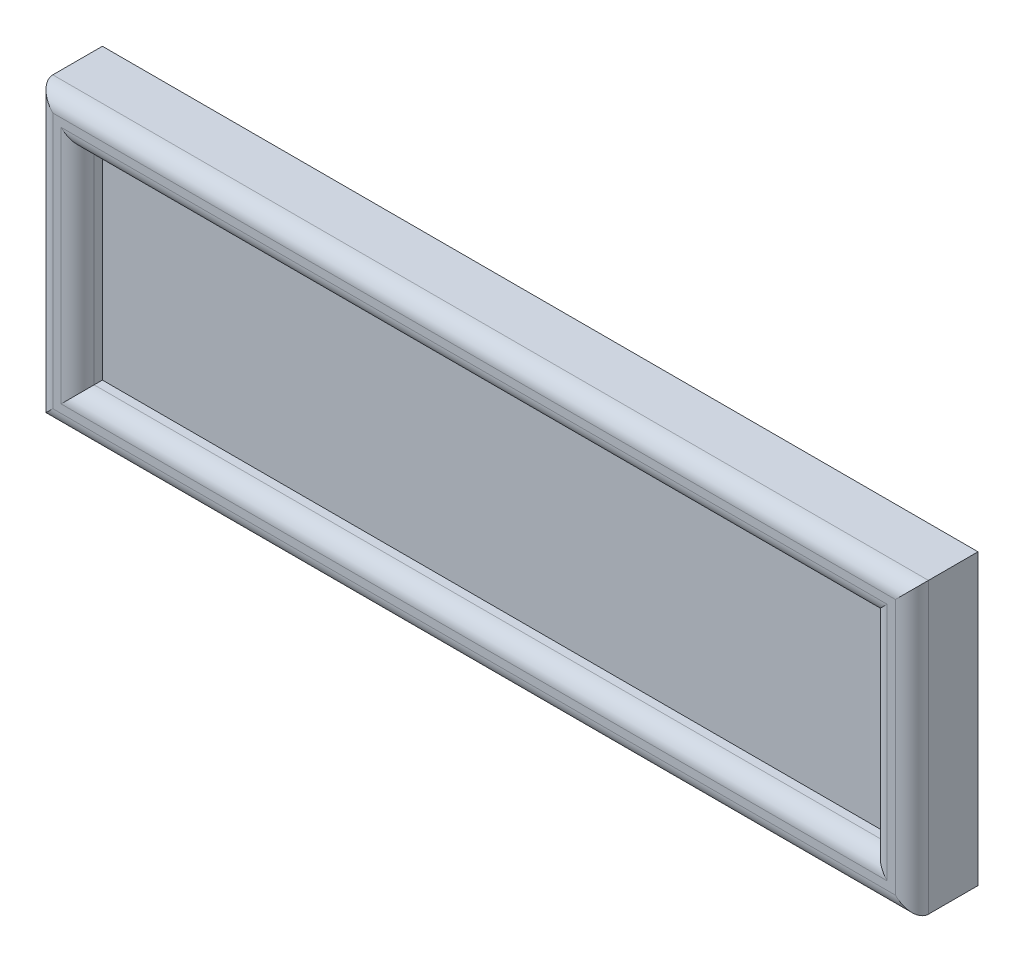
ISO-10303-21;
HEADER;
FILE_DESCRIPTION(('STEP AP214'),'2;1');
FILE_NAME('part.step','',(''),(''),'','','');
FILE_SCHEMA(('AUTOMOTIVE_DESIGN { 1 0 10303 214 1 1 1 1 }'));
ENDSEC;
DATA;
#1=APPLICATION_CONTEXT('core data for automotive mechanical design processes');
#2=APPLICATION_PROTOCOL_DEFINITION('international standard','automotive_design',2000,#1);
#3=PRODUCT_CONTEXT('',#1,'mechanical');
#4=PRODUCT('Part','Part','',(#3));
#5=PRODUCT_RELATED_PRODUCT_CATEGORY('part','',(#4));
#6=PRODUCT_DEFINITION_FORMATION('','',#4);
#7=PRODUCT_DEFINITION_CONTEXT('part definition',#1,'design');
#8=PRODUCT_DEFINITION('design','',#6,#7);
#9=PRODUCT_DEFINITION_SHAPE('','',#8);
#10=(LENGTH_UNIT() NAMED_UNIT(*) SI_UNIT(.MILLI.,.METRE.));
#11=(NAMED_UNIT(*) PLANE_ANGLE_UNIT() SI_UNIT($,.RADIAN.));
#12=(NAMED_UNIT(*) SI_UNIT($,.STERADIAN.) SOLID_ANGLE_UNIT());
#13=UNCERTAINTY_MEASURE_WITH_UNIT(LENGTH_MEASURE(1.E-05),#10,'distance_accuracy_value','');
#14=(GEOMETRIC_REPRESENTATION_CONTEXT(3) GLOBAL_UNCERTAINTY_ASSIGNED_CONTEXT((#13)) GLOBAL_UNIT_ASSIGNED_CONTEXT((#10,
#11,#12)) REPRESENTATION_CONTEXT('',''));
#15=CARTESIAN_POINT('',(0.,0.,0.));
#16=DIRECTION('',(0.,0.,1.));
#17=DIRECTION('',(1.,0.,0.));
#18=AXIS2_PLACEMENT_3D('',#15,#16,#17);
#19=CARTESIAN_POINT('',(-25.5,-7.75,-0.5));
#20=DIRECTION('',(-1.,0.,0.));
#21=DIRECTION('',(0.,0.,1.));
#22=AXIS2_PLACEMENT_3D('',#19,#20,#21);
#23=PLANE('',#22);
#24=DIRECTION('',(0.,0.,1.));
#25=VECTOR('',#24,1.);
#26=CARTESIAN_POINT('',(-25.5,-7.75,-0.5));
#27=LINE('',#26,#25);
#28=CARTESIAN_POINT('',(-25.5,-7.75,0.0999999999999987));
#29=VERTEX_POINT('',#28);
#30=CARTESIAN_POINT('',(-25.5,-7.75,0.5));
#31=VERTEX_POINT('',#30);
#32=EDGE_CURVE('E237',#29,#31,#27,.T.);
#33=ORIENTED_EDGE('',*,*,#32,.F.);
#34=DIRECTION('',(0.,1.,0.));
#35=VECTOR('',#34,1.);
#36=CARTESIAN_POINT('',(-25.5,-7.75,0.0999999999999987));
#37=LINE('',#36,#35);
#38=CARTESIAN_POINT('',(-25.5,7.75,0.100000000000004));
#39=VERTEX_POINT('',#38);
#40=EDGE_CURVE('E181',#29,#39,#37,.T.);
#41=ORIENTED_EDGE('',*,*,#40,.T.);
#42=DIRECTION('',(0.,0.,1.));
#43=VECTOR('',#42,1.);
#44=CARTESIAN_POINT('',(-25.5,7.75,-0.5));
#45=LINE('',#44,#43);
#46=CARTESIAN_POINT('',(-25.5,7.75,0.5));
#47=VERTEX_POINT('',#46);
#48=EDGE_CURVE('E252',#39,#47,#45,.T.);
#49=ORIENTED_EDGE('',*,*,#48,.T.);
#50=DIRECTION('',(0.,-1.,0.));
#51=VECTOR('',#50,1.);
#52=CARTESIAN_POINT('',(-25.5,-7.75,0.5));
#53=LINE('',#52,#51);
#54=EDGE_CURVE('E213',#47,#31,#53,.T.);
#55=ORIENTED_EDGE('',*,*,#54,.T.);
#56=EDGE_LOOP('',(#33,#41,#49,#55));
#57=FACE_BOUND('',#56,.T.);
#58=ADVANCED_FACE('F39',(#57),#23,.F.);
#59=CARTESIAN_POINT('',(-25.5,7.75,-0.5));
#60=VERTEX_POINT('',#59);
#61=CARTESIAN_POINT('',(-25.5,7.75,0.));
#62=VERTEX_POINT('',#61);
#63=EDGE_CURVE('E248',#60,#62,#45,.T.);
#64=ORIENTED_EDGE('',*,*,#63,.T.);
#65=DIRECTION('',(0.,-1.,0.));
#66=VECTOR('',#65,1.);
#67=CARTESIAN_POINT('',(-25.5,-7.75,0.));
#68=LINE('',#67,#66);
#69=CARTESIAN_POINT('',(-25.5,-7.75,0.));
#70=VERTEX_POINT('',#69);
#71=EDGE_CURVE('E201',#62,#70,#68,.T.);
#72=ORIENTED_EDGE('',*,*,#71,.T.);
#73=CARTESIAN_POINT('',(-25.5,-7.75,-0.5));
#74=VERTEX_POINT('',#73);
#75=EDGE_CURVE('E257',#74,#70,#27,.T.);
#76=ORIENTED_EDGE('',*,*,#75,.F.);
#77=DIRECTION('',(0.,-1.,0.));
#78=VECTOR('',#77,1.);
#79=CARTESIAN_POINT('',(-25.5,-7.75,-0.5));
#80=LINE('',#79,#78);
#81=EDGE_CURVE('E224',#60,#74,#80,.T.);
#82=ORIENTED_EDGE('',*,*,#81,.F.);
#83=EDGE_LOOP('',(#64,#72,#76,#82));
#84=FACE_BOUND('',#83,.T.);
#85=ADVANCED_FACE('F383',(#84),#23,.F.);
#86=CARTESIAN_POINT('',(25.5,7.75,-0.5));
#87=DIRECTION('',(0.,1.,0.));
#88=DIRECTION('',(0.,0.,1.));
#89=AXIS2_PLACEMENT_3D('',#86,#87,#88);
#90=PLANE('',#89);
#91=ORIENTED_EDGE('',*,*,#48,.F.);
#92=DIRECTION('',(1.,0.,0.));
#93=VECTOR('',#92,1.);
#94=CARTESIAN_POINT('',(-26.5,7.75,0.100000000000004));
#95=LINE('',#94,#93);
#96=CARTESIAN_POINT('',(-26.5,7.75,0.100000000000004));
#97=VERTEX_POINT('',#96);
#98=EDGE_CURVE('E199',#97,#39,#95,.T.);
#99=ORIENTED_EDGE('',*,*,#98,.F.);
#100=DIRECTION('',(0.,0.,1.));
#101=VECTOR('',#100,1.);
#102=CARTESIAN_POINT('',(-26.5,7.75,0.100000000000004));
#103=LINE('',#102,#101);
#104=CARTESIAN_POINT('',(-26.5,7.75,0.));
#105=VERTEX_POINT('',#104);
#106=EDGE_CURVE('E184',#105,#97,#103,.T.);
#107=ORIENTED_EDGE('',*,*,#106,.F.);
#108=DIRECTION('',(1.,0.,0.));
#109=VECTOR('',#108,1.);
#110=CARTESIAN_POINT('',(-26.5,7.75,0.));
#111=LINE('',#110,#109);
#112=EDGE_CURVE('E202',#105,#62,#111,.T.);
#113=ORIENTED_EDGE('',*,*,#112,.T.);
#114=ORIENTED_EDGE('',*,*,#63,.F.);
#115=DIRECTION('',(-1.,0.,0.));
#116=VECTOR('',#115,1.);
#117=CARTESIAN_POINT('',(25.5,7.75,-0.5));
#118=LINE('',#117,#116);
#119=CARTESIAN_POINT('',(25.5,7.75,-0.5));
#120=VERTEX_POINT('',#119);
#121=EDGE_CURVE('E234',#120,#60,#118,.T.);
#122=ORIENTED_EDGE('',*,*,#121,.F.);
#123=DIRECTION('',(0.,0.,1.));
#124=VECTOR('',#123,1.);
#125=CARTESIAN_POINT('',(25.5,7.75,-0.5));
#126=LINE('',#125,#124);
#127=CARTESIAN_POINT('',(25.5,7.75,0.5));
#128=VERTEX_POINT('',#127);
#129=EDGE_CURVE('E253',#120,#128,#126,.T.);
#130=ORIENTED_EDGE('',*,*,#129,.T.);
#131=DIRECTION('',(-1.,0.,0.));
#132=VECTOR('',#131,1.);
#133=CARTESIAN_POINT('',(25.5,7.75,0.5));
#134=LINE('',#133,#132);
#135=EDGE_CURVE('E228',#128,#47,#134,.T.);
#136=ORIENTED_EDGE('',*,*,#135,.T.);
#137=EDGE_LOOP('',(#91,#99,#107,#113,#114,#122,#130,#136));
#138=FACE_BOUND('',#137,.T.);
#139=ADVANCED_FACE('F389',(#138),#90,.F.);
#140=CARTESIAN_POINT('',(25.5,-7.75,-0.5));
#141=DIRECTION('',(1.,0.,0.));
#142=DIRECTION('',(0.,0.,-1.));
#143=AXIS2_PLACEMENT_3D('',#140,#141,#142);
#144=PLANE('',#143);
#145=DIRECTION('',(0.,1.,0.));
#146=VECTOR('',#145,1.);
#147=CARTESIAN_POINT('',(25.5,-7.75,0.5));
#148=LINE('',#147,#146);
#149=CARTESIAN_POINT('',(25.5,-7.75,0.5));
#150=VERTEX_POINT('',#149);
#151=EDGE_CURVE('E243',#150,#128,#148,.T.);
#152=ORIENTED_EDGE('',*,*,#151,.T.);
#153=ORIENTED_EDGE('',*,*,#129,.F.);
#154=DIRECTION('',(0.,1.,0.));
#155=VECTOR('',#154,1.);
#156=CARTESIAN_POINT('',(25.5,-7.75,-0.5));
#157=LINE('',#156,#155);
#158=CARTESIAN_POINT('',(25.5,-7.75,-0.5));
#159=VERTEX_POINT('',#158);
#160=EDGE_CURVE('E231',#159,#120,#157,.T.);
#161=ORIENTED_EDGE('',*,*,#160,.F.);
#162=DIRECTION('',(0.,0.,1.));
#163=VECTOR('',#162,1.);
#164=CARTESIAN_POINT('',(25.5,-7.75,-0.5));
#165=LINE('',#164,#163);
#166=EDGE_CURVE('E255',#159,#150,#165,.T.);
#167=ORIENTED_EDGE('',*,*,#166,.T.);
#168=EDGE_LOOP('',(#152,#153,#161,#167));
#169=FACE_BOUND('',#168,.T.);
#170=ADVANCED_FACE('F532',(#169),#144,.F.);
#171=CARTESIAN_POINT('',(25.5,-7.75,-0.5));
#172=DIRECTION('',(0.,-1.,0.));
#173=DIRECTION('',(0.,0.,-1.));
#174=AXIS2_PLACEMENT_3D('',#171,#172,#173);
#175=PLANE('',#174);
#176=ORIENTED_EDGE('',*,*,#75,.T.);
#177=DIRECTION('',(1.,0.,0.));
#178=VECTOR('',#177,1.);
#179=CARTESIAN_POINT('',(-26.5,-7.75,0.));
#180=LINE('',#179,#178);
#181=CARTESIAN_POINT('',(-26.5,-7.75,0.));
#182=VERTEX_POINT('',#181);
#183=EDGE_CURVE('E183',#182,#70,#180,.T.);
#184=ORIENTED_EDGE('',*,*,#183,.F.);
#185=DIRECTION('',(0.,0.,-1.));
#186=VECTOR('',#185,1.);
#187=CARTESIAN_POINT('',(-26.5,-7.75,0.0999999999999987));
#188=LINE('',#187,#186);
#189=CARTESIAN_POINT('',(-26.5,-7.75,0.0999999999999987));
#190=VERTEX_POINT('',#189);
#191=EDGE_CURVE('E187',#190,#182,#188,.T.);
#192=ORIENTED_EDGE('',*,*,#191,.F.);
#193=DIRECTION('',(1.,0.,0.));
#194=VECTOR('',#193,1.);
#195=CARTESIAN_POINT('',(-26.5,-7.75,0.0999999999999987));
#196=LINE('',#195,#194);
#197=EDGE_CURVE('E56',#190,#29,#196,.T.);
#198=ORIENTED_EDGE('',*,*,#197,.T.);
#199=ORIENTED_EDGE('',*,*,#32,.T.);
#200=DIRECTION('',(1.,0.,0.));
#201=VECTOR('',#200,1.);
#202=CARTESIAN_POINT('',(25.5,-7.75,0.5));
#203=LINE('',#202,#201);
#204=EDGE_CURVE('E240',#31,#150,#203,.T.);
#205=ORIENTED_EDGE('',*,*,#204,.T.);
#206=ORIENTED_EDGE('',*,*,#166,.F.);
#207=DIRECTION('',(1.,0.,0.));
#208=VECTOR('',#207,1.);
#209=CARTESIAN_POINT('',(25.5,-7.75,-0.5));
#210=LINE('',#209,#208);
#211=EDGE_CURVE('E227',#74,#159,#210,.T.);
#212=ORIENTED_EDGE('',*,*,#211,.F.);
#213=EDGE_LOOP('',(#176,#184,#192,#198,#199,#205,#206,#212));
#214=FACE_BOUND('',#213,.T.);
#215=ADVANCED_FACE('F189',(#214),#175,.F.);
#216=CARTESIAN_POINT('',(0.,0.,-0.5));
#217=DIRECTION('',(0.,0.,1.));
#218=DIRECTION('',(1.,0.,0.));
#219=AXIS2_PLACEMENT_3D('',#216,#217,#218);
#220=PLANE('',#219);
#221=ORIENTED_EDGE('',*,*,#81,.T.);
#222=ORIENTED_EDGE('',*,*,#211,.T.);
#223=ORIENTED_EDGE('',*,*,#160,.T.);
#224=ORIENTED_EDGE('',*,*,#121,.T.);
#225=EDGE_LOOP('',(#221,#222,#223,#224));
#226=FACE_BOUND('',#225,.T.);
#227=ADVANCED_FACE('F515',(#226),#220,.T.);
#228=CARTESIAN_POINT('',(0.,0.,0.5));
#229=DIRECTION('',(0.,0.,1.));
#230=DIRECTION('',(1.,0.,0.));
#231=AXIS2_PLACEMENT_3D('',#228,#229,#230);
#232=PLANE('',#231);
#233=DIRECTION('',(-1.,0.,0.));
#234=VECTOR('',#233,1.);
#235=CARTESIAN_POINT('',(0.,6.25,0.5));
#236=LINE('',#235,#234);
#237=CARTESIAN_POINT('',(24.,6.25,0.5));
#238=VERTEX_POINT('',#237);
#239=CARTESIAN_POINT('',(-24.,6.25,0.5));
#240=VERTEX_POINT('',#239);
#241=EDGE_CURVE('E284',#238,#240,#236,.T.);
#242=ORIENTED_EDGE('',*,*,#241,.T.);
#243=DIRECTION('',(0.,-1.,0.));
#244=VECTOR('',#243,1.);
#245=CARTESIAN_POINT('',(-24.,0.,0.5));
#246=LINE('',#245,#244);
#247=CARTESIAN_POINT('',(-24.,-6.25,0.5));
#248=VERTEX_POINT('',#247);
#249=EDGE_CURVE('E287',#240,#248,#246,.T.);
#250=ORIENTED_EDGE('',*,*,#249,.T.);
#251=DIRECTION('',(1.,0.,0.));
#252=VECTOR('',#251,1.);
#253=CARTESIAN_POINT('',(0.,-6.25,0.5));
#254=LINE('',#253,#252);
#255=CARTESIAN_POINT('',(24.,-6.25,0.5));
#256=VERTEX_POINT('',#255);
#257=EDGE_CURVE('E278',#248,#256,#254,.T.);
#258=ORIENTED_EDGE('',*,*,#257,.T.);
#259=DIRECTION('',(0.,1.,0.));
#260=VECTOR('',#259,1.);
#261=CARTESIAN_POINT('',(24.,0.,0.5));
#262=LINE('',#261,#260);
#263=EDGE_CURVE('E281',#256,#238,#262,.T.);
#264=ORIENTED_EDGE('',*,*,#263,.T.);
#265=EDGE_LOOP('',(#242,#250,#258,#264));
#266=FACE_BOUND('',#265,.T.);
#267=ORIENTED_EDGE('',*,*,#54,.F.);
#268=ORIENTED_EDGE('',*,*,#135,.F.);
#269=ORIENTED_EDGE('',*,*,#151,.F.);
#270=ORIENTED_EDGE('',*,*,#204,.F.);
#271=EDGE_LOOP('',(#267,#268,#269,#270));
#272=FACE_BOUND('',#271,.T.);
#273=ADVANCED_FACE('F366',(#266,#272),#232,.F.);
#274=CARTESIAN_POINT('',(-24.,-6.25,0.));
#275=DIRECTION('',(-1.,0.,0.));
#276=DIRECTION('',(0.,0.,1.));
#277=AXIS2_PLACEMENT_3D('',#274,#275,#276);
#278=PLANE('',#277);
#279=DIRECTION('',(0.,0.,1.));
#280=VECTOR('',#279,1.);
#281=CARTESIAN_POINT('',(-24.,6.25,0.));
#282=LINE('',#281,#280);
#283=CARTESIAN_POINT('',(-24.,6.25,1.));
#284=VERTEX_POINT('',#283);
#285=EDGE_CURVE('E210',#240,#284,#282,.T.);
#286=ORIENTED_EDGE('',*,*,#285,.T.);
#287=DIRECTION('',(0.,-1.,0.));
#288=VECTOR('',#287,1.);
#289=CARTESIAN_POINT('',(-24.,-6.25,1.));
#290=LINE('',#289,#288);
#291=CARTESIAN_POINT('',(-24.,-6.25,1.));
#292=VERTEX_POINT('',#291);
#293=EDGE_CURVE('E11',#284,#292,#290,.T.);
#294=ORIENTED_EDGE('',*,*,#293,.T.);
#295=DIRECTION('',(0.,0.,1.));
#296=VECTOR('',#295,1.);
#297=CARTESIAN_POINT('',(-24.,-6.25,0.));
#298=LINE('',#297,#296);
#299=EDGE_CURVE('E220',#248,#292,#298,.T.);
#300=ORIENTED_EDGE('',*,*,#299,.F.);
#301=ORIENTED_EDGE('',*,*,#249,.F.);
#302=EDGE_LOOP('',(#286,#294,#300,#301));
#303=FACE_BOUND('',#302,.T.);
#304=ADVANCED_FACE('F369',(#303),#278,.F.);
#305=CARTESIAN_POINT('',(24.,6.25,0.));
#306=DIRECTION('',(0.,1.,0.));
#307=DIRECTION('',(0.,0.,1.));
#308=AXIS2_PLACEMENT_3D('',#305,#306,#307);
#309=PLANE('',#308);
#310=DIRECTION('',(0.,0.,1.));
#311=VECTOR('',#310,1.);
#312=CARTESIAN_POINT('',(24.,6.25,0.));
#313=LINE('',#312,#311);
#314=CARTESIAN_POINT('',(24.,6.25,1.));
#315=VERTEX_POINT('',#314);
#316=EDGE_CURVE('E214',#238,#315,#313,.T.);
#317=ORIENTED_EDGE('',*,*,#316,.T.);
#318=DIRECTION('',(-1.,0.,0.));
#319=VECTOR('',#318,1.);
#320=CARTESIAN_POINT('',(-24.,6.25,1.));
#321=LINE('',#320,#319);
#322=EDGE_CURVE('E48',#315,#284,#321,.T.);
#323=ORIENTED_EDGE('',*,*,#322,.T.);
#324=ORIENTED_EDGE('',*,*,#285,.F.);
#325=ORIENTED_EDGE('',*,*,#241,.F.);
#326=EDGE_LOOP('',(#317,#323,#324,#325));
#327=FACE_BOUND('',#326,.T.);
#328=ADVANCED_FACE('F372',(#327),#309,.F.);
#329=CARTESIAN_POINT('',(24.,-6.25,0.));
#330=DIRECTION('',(1.,0.,0.));
#331=DIRECTION('',(0.,0.,-1.));
#332=AXIS2_PLACEMENT_3D('',#329,#330,#331);
#333=PLANE('',#332);
#334=DIRECTION('',(0.,0.,1.));
#335=VECTOR('',#334,1.);
#336=CARTESIAN_POINT('',(24.,-6.25,0.));
#337=LINE('',#336,#335);
#338=CARTESIAN_POINT('',(24.,-6.25,1.));
#339=VERTEX_POINT('',#338);
#340=EDGE_CURVE('E217',#256,#339,#337,.T.);
#341=ORIENTED_EDGE('',*,*,#340,.T.);
#342=DIRECTION('',(0.,1.,0.));
#343=VECTOR('',#342,1.);
#344=CARTESIAN_POINT('',(24.,6.25,1.));
#345=LINE('',#344,#343);
#346=EDGE_CURVE('E320',#339,#315,#345,.T.);
#347=ORIENTED_EDGE('',*,*,#346,.T.);
#348=ORIENTED_EDGE('',*,*,#316,.F.);
#349=ORIENTED_EDGE('',*,*,#263,.F.);
#350=EDGE_LOOP('',(#341,#347,#348,#349));
#351=FACE_BOUND('',#350,.T.);
#352=ADVANCED_FACE('F364',(#351),#333,.F.);
#353=CARTESIAN_POINT('',(24.,-6.25,0.));
#354=DIRECTION('',(0.,-1.,0.));
#355=DIRECTION('',(0.,0.,-1.));
#356=AXIS2_PLACEMENT_3D('',#353,#354,#355);
#357=PLANE('',#356);
#358=ORIENTED_EDGE('',*,*,#299,.T.);
#359=DIRECTION('',(1.,0.,0.));
#360=VECTOR('',#359,1.);
#361=CARTESIAN_POINT('',(24.,-6.25,1.));
#362=LINE('',#361,#360);
#363=EDGE_CURVE('E317',#292,#339,#362,.T.);
#364=ORIENTED_EDGE('',*,*,#363,.T.);
#365=ORIENTED_EDGE('',*,*,#340,.F.);
#366=ORIENTED_EDGE('',*,*,#257,.F.);
#367=EDGE_LOOP('',(#358,#364,#365,#366));
#368=FACE_BOUND('',#367,.T.);
#369=ADVANCED_FACE('F361',(#368),#357,.F.);
#370=CARTESIAN_POINT('',(-26.5,-8.75,2.));
#371=DIRECTION('',(1.,0.,0.));
#372=DIRECTION('',(0.,0.,-1.));
#373=AXIS2_PLACEMENT_3D('',#370,#371,#372);
#374=PLANE('',#373);
#375=ORIENTED_EDGE('',*,*,#106,.T.);
#376=DIRECTION('',(0.,-1.,0.));
#377=VECTOR('',#376,1.);
#378=CARTESIAN_POINT('',(-26.5,-7.75,0.0999999999999987));
#379=LINE('',#378,#377);
#380=EDGE_CURVE('E178',#97,#190,#379,.T.);
#381=ORIENTED_EDGE('',*,*,#380,.T.);
#382=ORIENTED_EDGE('',*,*,#191,.T.);
#383=DIRECTION('',(0.,1.,0.));
#384=VECTOR('',#383,1.);
#385=CARTESIAN_POINT('',(-26.5,-7.75,0.));
#386=LINE('',#385,#384);
#387=EDGE_CURVE('E64',#182,#105,#386,.T.);
#388=ORIENTED_EDGE('',*,*,#387,.T.);
#389=EDGE_LOOP('',(#375,#381,#382,#388));
#390=FACE_BOUND('',#389,.T.);
#391=DIRECTION('',(0.,0.,-1.));
#392=VECTOR('',#391,1.);
#393=CARTESIAN_POINT('',(-26.5,-8.75,2.));
#394=LINE('',#393,#392);
#395=CARTESIAN_POINT('',(-26.5,-8.75,1.));
#396=VERTEX_POINT('',#395);
#397=CARTESIAN_POINT('',(-26.5,-8.75,-2.));
#398=VERTEX_POINT('',#397);
#399=EDGE_CURVE('E276',#396,#398,#394,.T.);
#400=ORIENTED_EDGE('',*,*,#399,.F.);
#401=DIRECTION('',(0.,-1.,0.));
#402=VECTOR('',#401,1.);
#403=CARTESIAN_POINT('',(-26.5,8.75,1.));
#404=LINE('',#403,#402);
#405=CARTESIAN_POINT('',(-26.5,8.75,1.));
#406=VERTEX_POINT('',#405);
#407=EDGE_CURVE('E315',#396,#406,#404,.F.);
#408=ORIENTED_EDGE('',*,*,#407,.T.);
#409=DIRECTION('',(0.,0.,-1.));
#410=VECTOR('',#409,1.);
#411=CARTESIAN_POINT('',(-26.5,8.75,2.));
#412=LINE('',#411,#410);
#413=CARTESIAN_POINT('',(-26.5,8.75,-2.));
#414=VERTEX_POINT('',#413);
#415=EDGE_CURVE('E270',#406,#414,#412,.T.);
#416=ORIENTED_EDGE('',*,*,#415,.T.);
#417=DIRECTION('',(0.,-1.,0.));
#418=VECTOR('',#417,1.);
#419=CARTESIAN_POINT('',(-26.5,-8.75,-2.));
#420=LINE('',#419,#418);
#421=EDGE_CURVE('E251',#414,#398,#420,.T.);
#422=ORIENTED_EDGE('',*,*,#421,.T.);
#423=EDGE_LOOP('',(#400,#408,#416,#422));
#424=FACE_BOUND('',#423,.T.);
#425=ADVANCED_FACE('F192',(#390,#424),#374,.F.);
#426=CARTESIAN_POINT('',(26.5,-8.75,2.));
#427=DIRECTION('',(0.,1.,0.));
#428=DIRECTION('',(0.,0.,1.));
#429=AXIS2_PLACEMENT_3D('',#426,#427,#428);
#430=PLANE('',#429);
#431=DIRECTION('',(0.,0.,-1.));
#432=VECTOR('',#431,1.);
#433=CARTESIAN_POINT('',(26.5,-8.75,2.));
#434=LINE('',#433,#432);
#435=CARTESIAN_POINT('',(26.5,-8.75,1.));
#436=VERTEX_POINT('',#435);
#437=CARTESIAN_POINT('',(26.5,-8.75,-2.));
#438=VERTEX_POINT('',#437);
#439=EDGE_CURVE('E274',#436,#438,#434,.T.);
#440=ORIENTED_EDGE('',*,*,#439,.F.);
#441=DIRECTION('',(1.,0.,0.));
#442=VECTOR('',#441,1.);
#443=CARTESIAN_POINT('',(-26.5,-8.75,1.));
#444=LINE('',#443,#442);
#445=EDGE_CURVE('E313',#436,#396,#444,.F.);
#446=ORIENTED_EDGE('',*,*,#445,.T.);
#447=ORIENTED_EDGE('',*,*,#399,.T.);
#448=DIRECTION('',(1.,0.,0.));
#449=VECTOR('',#448,1.);
#450=CARTESIAN_POINT('',(26.5,-8.75,-2.));
#451=LINE('',#450,#449);
#452=EDGE_CURVE('E261',#398,#438,#451,.T.);
#453=ORIENTED_EDGE('',*,*,#452,.T.);
#454=EDGE_LOOP('',(#440,#446,#447,#453));
#455=FACE_BOUND('',#454,.T.);
#456=ADVANCED_FACE('F409',(#455),#430,.F.);
#457=CARTESIAN_POINT('',(26.5,-8.75,2.));
#458=DIRECTION('',(-1.,0.,0.));
#459=DIRECTION('',(0.,0.,1.));
#460=AXIS2_PLACEMENT_3D('',#457,#458,#459);
#461=PLANE('',#460);
#462=DIRECTION('',(0.,0.,-1.));
#463=VECTOR('',#462,1.);
#464=CARTESIAN_POINT('',(26.5,8.75,2.));
#465=LINE('',#464,#463);
#466=CARTESIAN_POINT('',(26.5,8.75,1.));
#467=VERTEX_POINT('',#466);
#468=CARTESIAN_POINT('',(26.5,8.75,-2.));
#469=VERTEX_POINT('',#468);
#470=EDGE_CURVE('E272',#467,#469,#465,.T.);
#471=ORIENTED_EDGE('',*,*,#470,.F.);
#472=DIRECTION('',(0.,1.,0.));
#473=VECTOR('',#472,1.);
#474=CARTESIAN_POINT('',(26.5,-8.75,1.));
#475=LINE('',#474,#473);
#476=EDGE_CURVE('E311',#467,#436,#475,.F.);
#477=ORIENTED_EDGE('',*,*,#476,.T.);
#478=ORIENTED_EDGE('',*,*,#439,.T.);
#479=DIRECTION('',(0.,1.,0.));
#480=VECTOR('',#479,1.);
#481=CARTESIAN_POINT('',(26.5,-8.75,-2.));
#482=LINE('',#481,#480);
#483=EDGE_CURVE('E264',#438,#469,#482,.T.);
#484=ORIENTED_EDGE('',*,*,#483,.T.);
#485=EDGE_LOOP('',(#471,#477,#478,#484));
#486=FACE_BOUND('',#485,.T.);
#487=ADVANCED_FACE('F405',(#486),#461,.F.);
#488=CARTESIAN_POINT('',(26.5,8.75,2.));
#489=DIRECTION('',(0.,-1.,0.));
#490=DIRECTION('',(0.,0.,-1.));
#491=AXIS2_PLACEMENT_3D('',#488,#489,#490);
#492=PLANE('',#491);
#493=ORIENTED_EDGE('',*,*,#415,.F.);
#494=DIRECTION('',(-1.,0.,0.));
#495=VECTOR('',#494,1.);
#496=CARTESIAN_POINT('',(26.5,8.75,1.));
#497=LINE('',#496,#495);
#498=EDGE_CURVE('E308',#406,#467,#497,.F.);
#499=ORIENTED_EDGE('',*,*,#498,.T.);
#500=ORIENTED_EDGE('',*,*,#470,.T.);
#501=DIRECTION('',(-1.,0.,0.));
#502=VECTOR('',#501,1.);
#503=CARTESIAN_POINT('',(26.5,8.75,-2.));
#504=LINE('',#503,#502);
#505=EDGE_CURVE('E267',#469,#414,#504,.T.);
#506=ORIENTED_EDGE('',*,*,#505,.T.);
#507=EDGE_LOOP('',(#493,#499,#500,#506));
#508=FACE_BOUND('',#507,.T.);
#509=ADVANCED_FACE('F397',(#508),#492,.F.);
#510=CARTESIAN_POINT('',(0.,0.,2.));
#511=DIRECTION('',(0.,0.,1.));
#512=DIRECTION('',(1.,0.,0.));
#513=AXIS2_PLACEMENT_3D('',#510,#511,#512);
#514=PLANE('',#513);
#515=DIRECTION('',(0.,1.,0.));
#516=VECTOR('',#515,1.);
#517=CARTESIAN_POINT('',(25.5,8.75,2.));
#518=LINE('',#517,#516);
#519=CARTESIAN_POINT('',(25.5,-7.75,2.));
#520=VERTEX_POINT('',#519);
#521=CARTESIAN_POINT('',(25.5,7.75,2.));
#522=VERTEX_POINT('',#521);
#523=EDGE_CURVE('E303',#520,#522,#518,.T.);
#524=ORIENTED_EDGE('',*,*,#523,.T.);
#525=DIRECTION('',(-1.,0.,0.));
#526=VECTOR('',#525,1.);
#527=CARTESIAN_POINT('',(-26.5,7.75,2.));
#528=LINE('',#527,#526);
#529=CARTESIAN_POINT('',(-25.5,7.75,2.));
#530=VERTEX_POINT('',#529);
#531=EDGE_CURVE('E305',#522,#530,#528,.T.);
#532=ORIENTED_EDGE('',*,*,#531,.T.);
#533=DIRECTION('',(0.,-1.,0.));
#534=VECTOR('',#533,1.);
#535=CARTESIAN_POINT('',(-25.5,-8.75,2.));
#536=LINE('',#535,#534);
#537=CARTESIAN_POINT('',(-25.5,-7.75,2.));
#538=VERTEX_POINT('',#537);
#539=EDGE_CURVE('E299',#530,#538,#536,.T.);
#540=ORIENTED_EDGE('',*,*,#539,.T.);
#541=DIRECTION('',(1.,0.,0.));
#542=VECTOR('',#541,1.);
#543=CARTESIAN_POINT('',(26.5,-7.75,2.));
#544=LINE('',#543,#542);
#545=EDGE_CURVE('E301',#538,#520,#544,.T.);
#546=ORIENTED_EDGE('',*,*,#545,.T.);
#547=EDGE_LOOP('',(#524,#532,#540,#546));
#548=FACE_BOUND('',#547,.T.);
#549=DIRECTION('',(0.,1.,0.));
#550=VECTOR('',#549,1.);
#551=CARTESIAN_POINT('',(25.,-6.25,2.));
#552=LINE('',#551,#550);
#553=CARTESIAN_POINT('',(25.,7.25,2.));
#554=VERTEX_POINT('',#553);
#555=CARTESIAN_POINT('',(25.,-7.25,2.));
#556=VERTEX_POINT('',#555);
#557=EDGE_CURVE('E294',#554,#556,#552,.F.);
#558=ORIENTED_EDGE('',*,*,#557,.T.);
#559=DIRECTION('',(1.,0.,0.));
#560=VECTOR('',#559,1.);
#561=CARTESIAN_POINT('',(-24.,-7.25,2.));
#562=LINE('',#561,#560);
#563=CARTESIAN_POINT('',(-25.,-7.25,2.));
#564=VERTEX_POINT('',#563);
#565=EDGE_CURVE('E296',#556,#564,#562,.F.);
#566=ORIENTED_EDGE('',*,*,#565,.T.);
#567=DIRECTION('',(0.,-1.,0.));
#568=VECTOR('',#567,1.);
#569=CARTESIAN_POINT('',(-25.,6.25,2.));
#570=LINE('',#569,#568);
#571=CARTESIAN_POINT('',(-25.,7.25,2.));
#572=VERTEX_POINT('',#571);
#573=EDGE_CURVE('E290',#564,#572,#570,.F.);
#574=ORIENTED_EDGE('',*,*,#573,.T.);
#575=DIRECTION('',(-1.,0.,0.));
#576=VECTOR('',#575,1.);
#577=CARTESIAN_POINT('',(24.,7.25,2.));
#578=LINE('',#577,#576);
#579=EDGE_CURVE('E292',#572,#554,#578,.F.);
#580=ORIENTED_EDGE('',*,*,#579,.T.);
#581=EDGE_LOOP('',(#558,#566,#574,#580));
#582=FACE_BOUND('',#581,.T.);
#583=ADVANCED_FACE('F351',(#548,#582),#514,.T.);
#584=CARTESIAN_POINT('',(0.,0.,-2.));
#585=DIRECTION('',(0.,0.,1.));
#586=DIRECTION('',(1.,0.,0.));
#587=AXIS2_PLACEMENT_3D('',#584,#585,#586);
#588=PLANE('',#587);
#589=ORIENTED_EDGE('',*,*,#421,.F.);
#590=ORIENTED_EDGE('',*,*,#505,.F.);
#591=ORIENTED_EDGE('',*,*,#483,.F.);
#592=ORIENTED_EDGE('',*,*,#452,.F.);
#593=EDGE_LOOP('',(#589,#590,#591,#592));
#594=FACE_BOUND('',#593,.T.);
#595=ADVANCED_FACE('F396',(#594),#588,.F.);
#596=CARTESIAN_POINT('',(0.,-7.75,1.));
#597=DIRECTION('',(-1.,0.,0.));
#598=DIRECTION('',(0.,0.,1.));
#599=AXIS2_PLACEMENT_3D('',#596,#597,#598);
#600=CYLINDRICAL_SURFACE('',#599,1.);
#601=CARTESIAN_POINT('',(-25.5,-7.75,1.));
#602=DIRECTION('',(-0.707106781186547,0.707106781186547,0.));
#603=DIRECTION('',(0.707106781186547,0.707106781186547,0.));
#604=AXIS2_PLACEMENT_3D('',#601,#602,#603);
#605=ELLIPSE('',#604,1.41421356237309,1.);
#606=EDGE_CURVE('E327',#396,#538,#605,.T.);
#607=ORIENTED_EDGE('',*,*,#606,.F.);
#608=ORIENTED_EDGE('',*,*,#445,.F.);
#609=CARTESIAN_POINT('',(25.5,-7.75,1.));
#610=DIRECTION('',(-0.707106781186547,-0.707106781186547,0.));
#611=DIRECTION('',(-0.707106781186547,0.707106781186547,0.));
#612=AXIS2_PLACEMENT_3D('',#609,#610,#611);
#613=ELLIPSE('',#612,1.41421356237309,1.);
#614=EDGE_CURVE('E223',#520,#436,#613,.F.);
#615=ORIENTED_EDGE('',*,*,#614,.F.);
#616=ORIENTED_EDGE('',*,*,#545,.F.);
#617=EDGE_LOOP('',(#607,#608,#615,#616));
#618=FACE_BOUND('',#617,.T.);
#619=ADVANCED_FACE('F401',(#618),#600,.T.);
#620=CARTESIAN_POINT('',(25.5,0.,1.));
#621=DIRECTION('',(0.,-1.,0.));
#622=DIRECTION('',(0.,0.,-1.));
#623=AXIS2_PLACEMENT_3D('',#620,#621,#622);
#624=CYLINDRICAL_SURFACE('',#623,1.);
#625=ORIENTED_EDGE('',*,*,#614,.T.);
#626=ORIENTED_EDGE('',*,*,#476,.F.);
#627=CARTESIAN_POINT('',(25.5,7.75,1.));
#628=DIRECTION('',(0.707106781186547,-0.707106781186547,0.));
#629=DIRECTION('',(-0.707106781186547,-0.707106781186547,0.));
#630=AXIS2_PLACEMENT_3D('',#627,#628,#629);
#631=ELLIPSE('',#630,1.41421356237309,1.);
#632=EDGE_CURVE('E325',#522,#467,#631,.F.);
#633=ORIENTED_EDGE('',*,*,#632,.F.);
#634=ORIENTED_EDGE('',*,*,#523,.F.);
#635=EDGE_LOOP('',(#625,#626,#633,#634));
#636=FACE_BOUND('',#635,.T.);
#637=ADVANCED_FACE('F423',(#636),#624,.T.);
#638=CARTESIAN_POINT('',(-25.5,0.,1.));
#639=DIRECTION('',(0.,1.,0.));
#640=DIRECTION('',(0.,0.,1.));
#641=AXIS2_PLACEMENT_3D('',#638,#639,#640);
#642=CYLINDRICAL_SURFACE('',#641,1.);
#643=ORIENTED_EDGE('',*,*,#606,.T.);
#644=ORIENTED_EDGE('',*,*,#539,.F.);
#645=CARTESIAN_POINT('',(-25.5,7.75,1.));
#646=DIRECTION('',(0.707106781186547,0.707106781186547,0.));
#647=DIRECTION('',(-0.707106781186547,0.707106781186547,0.));
#648=AXIS2_PLACEMENT_3D('',#645,#646,#647);
#649=ELLIPSE('',#648,1.41421356237309,1.);
#650=EDGE_CURVE('E323',#406,#530,#649,.T.);
#651=ORIENTED_EDGE('',*,*,#650,.F.);
#652=ORIENTED_EDGE('',*,*,#407,.F.);
#653=EDGE_LOOP('',(#643,#644,#651,#652));
#654=FACE_BOUND('',#653,.T.);
#655=ADVANCED_FACE('F419',(#654),#642,.T.);
#656=CARTESIAN_POINT('',(0.,7.75,1.));
#657=DIRECTION('',(1.,0.,0.));
#658=DIRECTION('',(0.,0.,-1.));
#659=AXIS2_PLACEMENT_3D('',#656,#657,#658);
#660=CYLINDRICAL_SURFACE('',#659,1.);
#661=ORIENTED_EDGE('',*,*,#632,.T.);
#662=ORIENTED_EDGE('',*,*,#498,.F.);
#663=ORIENTED_EDGE('',*,*,#650,.T.);
#664=ORIENTED_EDGE('',*,*,#531,.F.);
#665=EDGE_LOOP('',(#661,#662,#663,#664));
#666=FACE_BOUND('',#665,.T.);
#667=ADVANCED_FACE('F416',(#666),#660,.T.);
#668=CARTESIAN_POINT('',(24.,7.25,1.));
#669=DIRECTION('',(1.,0.,0.));
#670=DIRECTION('',(0.,0.,-1.));
#671=AXIS2_PLACEMENT_3D('',#668,#669,#670);
#672=CYLINDRICAL_SURFACE('',#671,1.);
#673=CARTESIAN_POINT('',(25.,7.25,1.));
#674=DIRECTION('',(0.707106781186547,-0.707106781186547,0.));
#675=DIRECTION('',(-0.707106781186547,-0.707106781186547,0.));
#676=AXIS2_PLACEMENT_3D('',#673,#674,#675);
#677=ELLIPSE('',#676,1.41421356237309,1.);
#678=EDGE_CURVE('E334',#554,#315,#677,.T.);
#679=ORIENTED_EDGE('',*,*,#678,.F.);
#680=ORIENTED_EDGE('',*,*,#579,.F.);
#681=CARTESIAN_POINT('',(-25.,7.25,1.));
#682=DIRECTION('',(0.707106781186547,0.707106781186547,0.));
#683=DIRECTION('',(0.707106781186547,-0.707106781186547,0.));
#684=AXIS2_PLACEMENT_3D('',#681,#682,#683);
#685=ELLIPSE('',#684,1.41421356237309,1.);
#686=EDGE_CURVE('E43',#284,#572,#685,.F.);
#687=ORIENTED_EDGE('',*,*,#686,.F.);
#688=ORIENTED_EDGE('',*,*,#322,.F.);
#689=EDGE_LOOP('',(#679,#680,#687,#688));
#690=FACE_BOUND('',#689,.T.);
#691=ADVANCED_FACE('F41',(#690),#672,.T.);
#692=CARTESIAN_POINT('',(-25.,-6.25,1.));
#693=DIRECTION('',(0.,1.,0.));
#694=DIRECTION('',(0.,0.,1.));
#695=AXIS2_PLACEMENT_3D('',#692,#693,#694);
#696=CYLINDRICAL_SURFACE('',#695,1.);
#697=ORIENTED_EDGE('',*,*,#686,.T.);
#698=ORIENTED_EDGE('',*,*,#573,.F.);
#699=CARTESIAN_POINT('',(-25.,-7.25,1.));
#700=DIRECTION('',(-0.707106781186547,0.707106781186547,0.));
#701=DIRECTION('',(-0.707106781186547,-0.707106781186547,0.));
#702=AXIS2_PLACEMENT_3D('',#699,#700,#701);
#703=ELLIPSE('',#702,1.41421356237309,1.);
#704=EDGE_CURVE('E333',#292,#564,#703,.F.);
#705=ORIENTED_EDGE('',*,*,#704,.F.);
#706=ORIENTED_EDGE('',*,*,#293,.F.);
#707=EDGE_LOOP('',(#697,#698,#705,#706));
#708=FACE_BOUND('',#707,.T.);
#709=ADVANCED_FACE('F345',(#708),#696,.T.);
#710=CARTESIAN_POINT('',(25.,-6.25,1.));
#711=DIRECTION('',(0.,-1.,0.));
#712=DIRECTION('',(0.,0.,-1.));
#713=AXIS2_PLACEMENT_3D('',#710,#711,#712);
#714=CYLINDRICAL_SURFACE('',#713,1.);
#715=ORIENTED_EDGE('',*,*,#678,.T.);
#716=ORIENTED_EDGE('',*,*,#346,.F.);
#717=CARTESIAN_POINT('',(25.,-7.25,1.));
#718=DIRECTION('',(-0.707106781186547,-0.707106781186547,0.));
#719=DIRECTION('',(-0.707106781186547,0.707106781186547,0.));
#720=AXIS2_PLACEMENT_3D('',#717,#718,#719);
#721=ELLIPSE('',#720,1.41421356237309,1.);
#722=EDGE_CURVE('E209',#556,#339,#721,.T.);
#723=ORIENTED_EDGE('',*,*,#722,.F.);
#724=ORIENTED_EDGE('',*,*,#557,.F.);
#725=EDGE_LOOP('',(#715,#716,#723,#724));
#726=FACE_BOUND('',#725,.T.);
#727=ADVANCED_FACE('F357',(#726),#714,.T.);
#728=CARTESIAN_POINT('',(24.,-7.25,1.));
#729=DIRECTION('',(-1.,0.,0.));
#730=DIRECTION('',(0.,0.,1.));
#731=AXIS2_PLACEMENT_3D('',#728,#729,#730);
#732=CYLINDRICAL_SURFACE('',#731,1.);
#733=ORIENTED_EDGE('',*,*,#704,.T.);
#734=ORIENTED_EDGE('',*,*,#565,.F.);
#735=ORIENTED_EDGE('',*,*,#722,.T.);
#736=ORIENTED_EDGE('',*,*,#363,.F.);
#737=EDGE_LOOP('',(#733,#734,#735,#736));
#738=FACE_BOUND('',#737,.T.);
#739=ADVANCED_FACE('F355',(#738),#732,.T.);
#740=CARTESIAN_POINT('',(-26.5,-7.75,0.0999999999999987));
#741=DIRECTION('',(0.,0.,1.));
#742=DIRECTION('',(0.,-1.,0.));
#743=AXIS2_PLACEMENT_3D('',#740,#741,#742);
#744=PLANE('',#743);
#745=ORIENTED_EDGE('',*,*,#197,.F.);
#746=ORIENTED_EDGE('',*,*,#380,.F.);
#747=ORIENTED_EDGE('',*,*,#98,.T.);
#748=ORIENTED_EDGE('',*,*,#40,.F.);
#749=EDGE_LOOP('',(#745,#746,#747,#748));
#750=FACE_BOUND('',#749,.T.);
#751=ADVANCED_FACE('F176',(#750),#744,.F.);
#752=CARTESIAN_POINT('',(-26.5,-7.75,0.));
#753=DIRECTION('',(0.,0.,-1.));
#754=DIRECTION('',(0.,1.,0.));
#755=AXIS2_PLACEMENT_3D('',#752,#753,#754);
#756=PLANE('',#755);
#757=ORIENTED_EDGE('',*,*,#112,.F.);
#758=ORIENTED_EDGE('',*,*,#387,.F.);
#759=ORIENTED_EDGE('',*,*,#183,.T.);
#760=ORIENTED_EDGE('',*,*,#71,.F.);
#761=EDGE_LOOP('',(#757,#758,#759,#760));
#762=FACE_BOUND('',#761,.T.);
#763=ADVANCED_FACE('F663',(#762),#756,.F.);
#764=CLOSED_SHELL('',(#58,#85,#139,#170,#215,#227,#273,#304,#328,#352,#369,#425,#456,#487,#509,
#583,#595,#619,#637,#655,#667,#691,#709,#727,#739,#751,#763));
#765=MANIFOLD_SOLID_BREP('B2',#764);
#766=ADVANCED_BREP_SHAPE_REPRESENTATION('',(#18,#765),#14);
#767=SHAPE_DEFINITION_REPRESENTATION(#9,#766);
ENDSEC;
END-ISO-10303-21;
